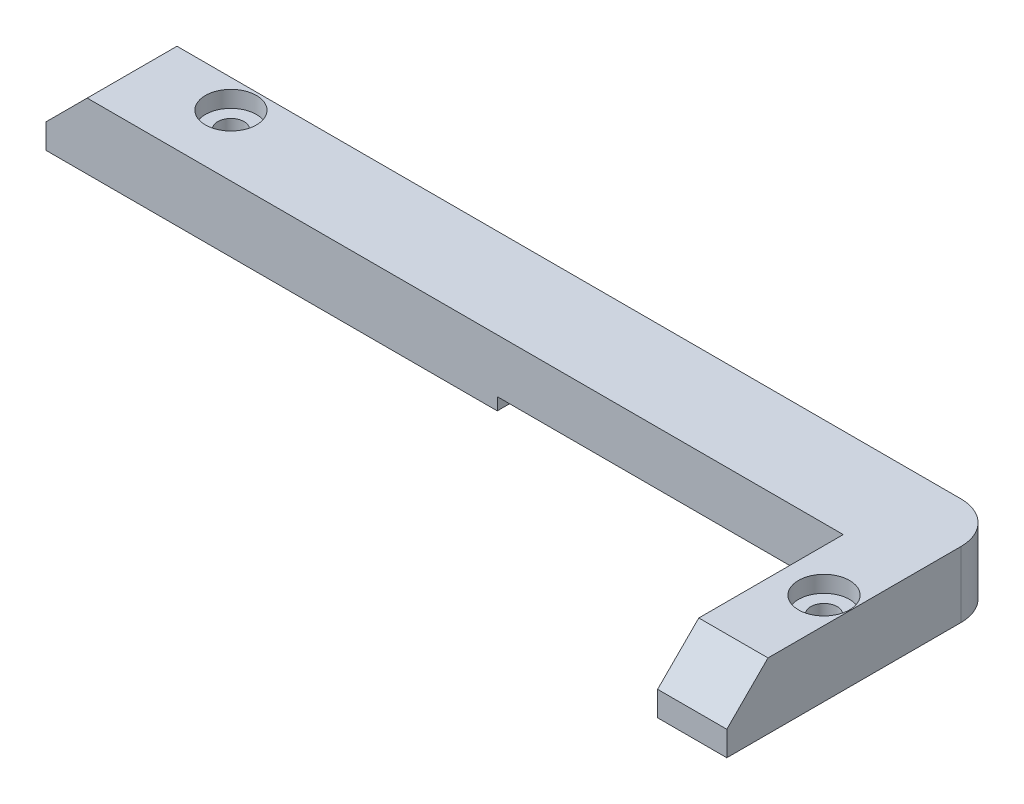
ISO-10303-21;
HEADER;
FILE_DESCRIPTION(('STEP AP214'),'2;1');
FILE_NAME('part.step','',(''),(''),'','','');
FILE_SCHEMA(('AUTOMOTIVE_DESIGN { 1 0 10303 214 1 1 1 1 }'));
ENDSEC;
DATA;
#1=APPLICATION_CONTEXT('core data for automotive mechanical design processes');
#2=APPLICATION_PROTOCOL_DEFINITION('international standard','automotive_design',2000,#1);
#3=PRODUCT_CONTEXT('',#1,'mechanical');
#4=PRODUCT('Part','Part','',(#3));
#5=PRODUCT_RELATED_PRODUCT_CATEGORY('part','',(#4));
#6=PRODUCT_DEFINITION_FORMATION('','',#4);
#7=PRODUCT_DEFINITION_CONTEXT('part definition',#1,'design');
#8=PRODUCT_DEFINITION('design','',#6,#7);
#9=PRODUCT_DEFINITION_SHAPE('','',#8);
#10=(LENGTH_UNIT() NAMED_UNIT(*) SI_UNIT(.MILLI.,.METRE.));
#11=(NAMED_UNIT(*) PLANE_ANGLE_UNIT() SI_UNIT($,.RADIAN.));
#12=(NAMED_UNIT(*) SI_UNIT($,.STERADIAN.) SOLID_ANGLE_UNIT());
#13=UNCERTAINTY_MEASURE_WITH_UNIT(LENGTH_MEASURE(1.E-05),#10,'distance_accuracy_value','');
#14=(GEOMETRIC_REPRESENTATION_CONTEXT(3) GLOBAL_UNCERTAINTY_ASSIGNED_CONTEXT((#13)) GLOBAL_UNIT_ASSIGNED_CONTEXT((#10,
#11,#12)) REPRESENTATION_CONTEXT('',''));
#15=CARTESIAN_POINT('',(0.,0.,0.));
#16=DIRECTION('',(0.,0.,1.));
#17=DIRECTION('',(1.,0.,0.));
#18=AXIS2_PLACEMENT_3D('',#15,#16,#17);
#19=CARTESIAN_POINT('',(328.95,0.,0.));
#20=DIRECTION('',(1.,0.,0.));
#21=DIRECTION('',(0.,0.,-1.));
#22=AXIS2_PLACEMENT_3D('',#19,#20,#21);
#23=PLANE('',#22);
#24=DIRECTION('',(0.,-1.,0.));
#25=VECTOR('',#24,1.);
#26=CARTESIAN_POINT('',(328.95,0.,-83.435));
#27=LINE('',#26,#25);
#28=CARTESIAN_POINT('',(328.95,2.99999999999998,-83.435));
#29=VERTEX_POINT('',#28);
#30=CARTESIAN_POINT('',(328.95,0.,-83.435));
#31=VERTEX_POINT('',#30);
#32=EDGE_CURVE('E206',#29,#31,#27,.T.);
#33=ORIENTED_EDGE('',*,*,#32,.F.);
#34=DIRECTION('',(0.,0.707106781186549,-0.707106781186547));
#35=VECTOR('',#34,1.);
#36=CARTESIAN_POINT('',(328.95,8.,-88.435));
#37=LINE('',#36,#35);
#38=CARTESIAN_POINT('',(328.95,8.,-88.435));
#39=VERTEX_POINT('',#38);
#40=EDGE_CURVE('E196',#29,#39,#37,.T.);
#41=ORIENTED_EDGE('',*,*,#40,.T.);
#42=DIRECTION('',(0.,0.,-1.));
#43=VECTOR('',#42,1.);
#44=CARTESIAN_POINT('',(328.95,8.,-6.9));
#45=LINE('',#44,#43);
#46=CARTESIAN_POINT('',(328.95,8.,-105.97));
#47=VERTEX_POINT('',#46);
#48=EDGE_CURVE('E203',#39,#47,#45,.T.);
#49=ORIENTED_EDGE('',*,*,#48,.T.);
#50=DIRECTION('',(0.,-1.,0.));
#51=VECTOR('',#50,1.);
#52=CARTESIAN_POINT('',(328.95,8.,-105.97));
#53=LINE('',#52,#51);
#54=CARTESIAN_POINT('',(328.95,1.5,-105.97));
#55=VERTEX_POINT('',#54);
#56=EDGE_CURVE('E215',#47,#55,#53,.T.);
#57=ORIENTED_EDGE('',*,*,#56,.T.);
#58=DIRECTION('',(0.,0.,1.));
#59=VECTOR('',#58,1.);
#60=CARTESIAN_POINT('',(328.95,1.5,-116.87));
#61=LINE('',#60,#59);
#62=CARTESIAN_POINT('',(328.95,1.5,-116.87));
#63=VERTEX_POINT('',#62);
#64=EDGE_CURVE('E252',#63,#55,#61,.T.);
#65=ORIENTED_EDGE('',*,*,#64,.F.);
#66=DIRECTION('',(0.,1.,0.));
#67=VECTOR('',#66,1.);
#68=CARTESIAN_POINT('',(328.95,-3.,-116.87));
#69=LINE('',#68,#67);
#70=CARTESIAN_POINT('',(328.95,0.,-116.87));
#71=VERTEX_POINT('',#70);
#72=EDGE_CURVE('E245',#71,#63,#69,.T.);
#73=ORIENTED_EDGE('',*,*,#72,.F.);
#74=DIRECTION('',(0.,0.,1.));
#75=VECTOR('',#74,1.);
#76=CARTESIAN_POINT('',(328.95,0.,0.));
#77=LINE('',#76,#75);
#78=EDGE_CURVE('E216',#71,#31,#77,.T.);
#79=ORIENTED_EDGE('',*,*,#78,.T.);
#80=EDGE_LOOP('',(#33,#41,#49,#57,#65,#73,#79));
#81=FACE_BOUND('',#80,.T.);
#82=ADVANCED_FACE('F46',(#81),#23,.F.);
#83=CARTESIAN_POINT('',(0.,0.,0.));
#84=DIRECTION('',(0.,-1.,0.));
#85=DIRECTION('',(0.,0.,-1.));
#86=AXIS2_PLACEMENT_3D('',#83,#84,#85);
#87=PLANE('',#86);
#88=CARTESIAN_POINT('',(334.15,0.,-98.435));
#89=DIRECTION('',(0.,1.,0.));
#90=DIRECTION('',(0.,0.,1.));
#91=AXIS2_PLACEMENT_3D('',#88,#89,#90);
#92=CIRCLE('',#91,1.59999999999999);
#93=CARTESIAN_POINT('',(334.15,0.,-96.835));
#94=VERTEX_POINT('',#93);
#95=EDGE_CURVE('E161',#94,#94,#92,.T.);
#96=ORIENTED_EDGE('',*,*,#95,.T.);
#97=EDGE_LOOP('',(#96));
#98=FACE_BOUND('',#97,.T.);
#99=DIRECTION('',(0.,0.,-1.));
#100=VECTOR('',#99,1.);
#101=CARTESIAN_POINT('',(337.35,0.,0.));
#102=LINE('',#101,#100);
#103=CARTESIAN_POINT('',(337.35,0.,-83.435));
#104=VERTEX_POINT('',#103);
#105=CARTESIAN_POINT('',(337.35,0.,-111.87));
#106=VERTEX_POINT('',#105);
#107=EDGE_CURVE('E157',#104,#106,#102,.T.);
#108=ORIENTED_EDGE('',*,*,#107,.F.);
#109=DIRECTION('',(1.,0.,0.));
#110=VECTOR('',#109,1.);
#111=CARTESIAN_POINT('',(232.17,0.,-83.435));
#112=LINE('',#111,#110);
#113=EDGE_CURVE('E149',#31,#104,#112,.T.);
#114=ORIENTED_EDGE('',*,*,#113,.F.);
#115=ORIENTED_EDGE('',*,*,#78,.F.);
#116=DIRECTION('',(-1.,0.,0.));
#117=VECTOR('',#116,1.);
#118=CARTESIAN_POINT('',(0.,0.,-116.87));
#119=LINE('',#118,#117);
#120=CARTESIAN_POINT('',(332.35,0.,-116.87));
#121=VERTEX_POINT('',#120);
#122=EDGE_CURVE('E156',#121,#71,#119,.T.);
#123=ORIENTED_EDGE('',*,*,#122,.F.);
#124=CARTESIAN_POINT('',(332.35,0.,-111.87));
#125=DIRECTION('',(0.,-1.,0.));
#126=DIRECTION('',(0.,0.,-1.));
#127=AXIS2_PLACEMENT_3D('',#124,#125,#126);
#128=CIRCLE('',#127,5.);
#129=EDGE_CURVE('E165',#121,#106,#128,.T.);
#130=ORIENTED_EDGE('',*,*,#129,.T.);
#131=EDGE_LOOP('',(#108,#114,#115,#123,#130));
#132=FACE_BOUND('',#131,.T.);
#133=ADVANCED_FACE('F281',(#98,#132),#87,.T.);
#134=CARTESIAN_POINT('',(0.,0.,-105.97));
#135=DIRECTION('',(0.,0.,-1.));
#136=DIRECTION('',(-1.,0.,0.));
#137=AXIS2_PLACEMENT_3D('',#134,#135,#136);
#138=PLANE('',#137);
#139=DIRECTION('',(-1.,0.,0.));
#140=VECTOR('',#139,1.);
#141=CARTESIAN_POINT('',(73.9,8.,-105.97));
#142=LINE('',#141,#140);
#143=CARTESIAN_POINT('',(237.17,8.,-105.97));
#144=VERTEX_POINT('',#143);
#145=EDGE_CURVE('E214',#47,#144,#142,.T.);
#146=ORIENTED_EDGE('',*,*,#145,.T.);
#147=DIRECTION('',(-0.707106781186544,-0.707106781186551,0.));
#148=VECTOR('',#147,1.);
#149=CARTESIAN_POINT('',(237.17,8.,-105.97));
#150=LINE('',#149,#148);
#151=CARTESIAN_POINT('',(232.17,3.,-105.97));
#152=VERTEX_POINT('',#151);
#153=EDGE_CURVE('E69',#144,#152,#150,.T.);
#154=ORIENTED_EDGE('',*,*,#153,.T.);
#155=DIRECTION('',(0.,1.,0.));
#156=VECTOR('',#155,1.);
#157=CARTESIAN_POINT('',(232.17,0.,-105.97));
#158=LINE('',#157,#156);
#159=CARTESIAN_POINT('',(232.17,0.,-105.97));
#160=VERTEX_POINT('',#159);
#161=EDGE_CURVE('E228',#160,#152,#158,.T.);
#162=ORIENTED_EDGE('',*,*,#161,.F.);
#163=DIRECTION('',(1.,0.,0.));
#164=VECTOR('',#163,1.);
#165=CARTESIAN_POINT('',(0.,0.,-105.97));
#166=LINE('',#165,#164);
#167=CARTESIAN_POINT('',(286.95,0.,-105.97));
#168=VERTEX_POINT('',#167);
#169=EDGE_CURVE('E148',#160,#168,#166,.T.);
#170=ORIENTED_EDGE('',*,*,#169,.T.);
#171=DIRECTION('',(0.,-1.,0.));
#172=VECTOR('',#171,1.);
#173=CARTESIAN_POINT('',(286.95,-3.00000000000001,-105.97));
#174=LINE('',#173,#172);
#175=CARTESIAN_POINT('',(286.95,1.5,-105.97));
#176=VERTEX_POINT('',#175);
#177=EDGE_CURVE('E249',#176,#168,#174,.T.);
#178=ORIENTED_EDGE('',*,*,#177,.F.);
#179=DIRECTION('',(-1.,0.,0.));
#180=VECTOR('',#179,1.);
#181=CARTESIAN_POINT('',(328.95,1.5,-105.97));
#182=LINE('',#181,#180);
#183=EDGE_CURVE('E182',#55,#176,#182,.T.);
#184=ORIENTED_EDGE('',*,*,#183,.F.);
#185=ORIENTED_EDGE('',*,*,#56,.F.);
#186=EDGE_LOOP('',(#146,#154,#162,#170,#178,#184,#185));
#187=FACE_BOUND('',#186,.T.);
#188=ADVANCED_FACE('F286',(#187),#138,.F.);
#189=CARTESIAN_POINT('',(0.,8.,0.));
#190=DIRECTION('',(0.,-1.,0.));
#191=DIRECTION('',(0.,0.,-1.));
#192=AXIS2_PLACEMENT_3D('',#189,#190,#191);
#193=PLANE('',#192);
#194=CARTESIAN_POINT('',(247.17,8.,-113.42));
#195=DIRECTION('',(0.,1.,0.));
#196=DIRECTION('',(0.,0.,1.));
#197=AXIS2_PLACEMENT_3D('',#194,#195,#196);
#198=CIRCLE('',#197,3.09999999999999);
#199=CARTESIAN_POINT('',(247.17,8.,-110.32));
#200=VERTEX_POINT('',#199);
#201=EDGE_CURVE('E237',#200,#200,#198,.T.);
#202=ORIENTED_EDGE('',*,*,#201,.F.);
#203=EDGE_LOOP('',(#202));
#204=FACE_BOUND('',#203,.T.);
#205=CARTESIAN_POINT('',(334.15,8.,-98.435));
#206=DIRECTION('',(0.,1.,0.));
#207=DIRECTION('',(0.,0.,1.));
#208=AXIS2_PLACEMENT_3D('',#205,#206,#207);
#209=CIRCLE('',#208,3.09999999999999);
#210=CARTESIAN_POINT('',(334.15,8.,-95.335));
#211=VERTEX_POINT('',#210);
#212=EDGE_CURVE('E234',#211,#211,#209,.T.);
#213=ORIENTED_EDGE('',*,*,#212,.F.);
#214=EDGE_LOOP('',(#213));
#215=FACE_BOUND('',#214,.T.);
#216=ORIENTED_EDGE('',*,*,#48,.F.);
#217=DIRECTION('',(1.,0.,0.));
#218=VECTOR('',#217,1.);
#219=CARTESIAN_POINT('',(337.35,8.,-88.435));
#220=LINE('',#219,#218);
#221=CARTESIAN_POINT('',(337.35,8.,-88.435));
#222=VERTEX_POINT('',#221);
#223=EDGE_CURVE('E189',#39,#222,#220,.T.);
#224=ORIENTED_EDGE('',*,*,#223,.T.);
#225=DIRECTION('',(0.,0.,-1.));
#226=VECTOR('',#225,1.);
#227=CARTESIAN_POINT('',(337.35,8.,0.));
#228=LINE('',#227,#226);
#229=CARTESIAN_POINT('',(337.35,8.,-111.87));
#230=VERTEX_POINT('',#229);
#231=EDGE_CURVE('E160',#222,#230,#228,.T.);
#232=ORIENTED_EDGE('',*,*,#231,.T.);
#233=CARTESIAN_POINT('',(332.35,8.,-111.87));
#234=DIRECTION('',(0.,-1.,0.));
#235=DIRECTION('',(0.,0.,-1.));
#236=AXIS2_PLACEMENT_3D('',#233,#234,#235);
#237=CIRCLE('',#236,5.);
#238=CARTESIAN_POINT('',(332.35,8.,-116.87));
#239=VERTEX_POINT('',#238);
#240=EDGE_CURVE('E168',#230,#239,#237,.F.);
#241=ORIENTED_EDGE('',*,*,#240,.T.);
#242=DIRECTION('',(-1.,0.,0.));
#243=VECTOR('',#242,1.);
#244=CARTESIAN_POINT('',(0.,8.,-116.87));
#245=LINE('',#244,#243);
#246=CARTESIAN_POINT('',(237.17,8.,-116.87));
#247=VERTEX_POINT('',#246);
#248=EDGE_CURVE('E169',#239,#247,#245,.T.);
#249=ORIENTED_EDGE('',*,*,#248,.T.);
#250=DIRECTION('',(0.,0.,1.));
#251=VECTOR('',#250,1.);
#252=CARTESIAN_POINT('',(237.17,8.,-105.97));
#253=LINE('',#252,#251);
#254=EDGE_CURVE('E186',#247,#144,#253,.T.);
#255=ORIENTED_EDGE('',*,*,#254,.T.);
#256=ORIENTED_EDGE('',*,*,#145,.F.);
#257=EDGE_LOOP('',(#216,#224,#232,#241,#249,#255,#256));
#258=FACE_BOUND('',#257,.T.);
#259=ADVANCED_FACE('F212',(#204,#215,#258),#193,.F.);
#260=CARTESIAN_POINT('',(247.17,0.,-113.42));
#261=DIRECTION('',(0.,1.,0.));
#262=DIRECTION('',(0.,0.,1.));
#263=AXIS2_PLACEMENT_3D('',#260,#261,#262);
#264=CIRCLE('',#263,1.59999999999999);
#265=CARTESIAN_POINT('',(247.17,0.,-111.82));
#266=VERTEX_POINT('',#265);
#267=EDGE_CURVE('E265',#266,#266,#264,.T.);
#268=ORIENTED_EDGE('',*,*,#267,.T.);
#269=EDGE_LOOP('',(#268));
#270=FACE_BOUND('',#269,.T.);
#271=ORIENTED_EDGE('',*,*,#169,.F.);
#272=DIRECTION('',(0.,0.,1.));
#273=VECTOR('',#272,1.);
#274=CARTESIAN_POINT('',(232.17,0.,-117.98568135859));
#275=LINE('',#274,#273);
#276=CARTESIAN_POINT('',(232.17,0.,-116.87));
#277=VERTEX_POINT('',#276);
#278=EDGE_CURVE('E135',#277,#160,#275,.T.);
#279=ORIENTED_EDGE('',*,*,#278,.F.);
#280=CARTESIAN_POINT('',(286.95,0.,-116.87));
#281=VERTEX_POINT('',#280);
#282=EDGE_CURVE('E147',#281,#277,#119,.T.);
#283=ORIENTED_EDGE('',*,*,#282,.F.);
#284=DIRECTION('',(0.,0.,-1.));
#285=VECTOR('',#284,1.);
#286=CARTESIAN_POINT('',(286.95,0.,0.));
#287=LINE('',#286,#285);
#288=EDGE_CURVE('E259',#168,#281,#287,.T.);
#289=ORIENTED_EDGE('',*,*,#288,.F.);
#290=EDGE_LOOP('',(#271,#279,#283,#289));
#291=FACE_BOUND('',#290,.T.);
#292=ADVANCED_FACE('F145',(#270,#291),#87,.T.);
#293=CARTESIAN_POINT('',(337.35,8.,0.));
#294=DIRECTION('',(-1.,0.,0.));
#295=DIRECTION('',(0.,0.,1.));
#296=AXIS2_PLACEMENT_3D('',#293,#294,#295);
#297=PLANE('',#296);
#298=ORIENTED_EDGE('',*,*,#231,.F.);
#299=DIRECTION('',(0.,-0.707106781186549,0.707106781186547));
#300=VECTOR('',#299,1.);
#301=CARTESIAN_POINT('',(337.35,8.,-88.435));
#302=LINE('',#301,#300);
#303=CARTESIAN_POINT('',(337.35,2.99999999999998,-83.435));
#304=VERTEX_POINT('',#303);
#305=EDGE_CURVE('E192',#222,#304,#302,.T.);
#306=ORIENTED_EDGE('',*,*,#305,.T.);
#307=DIRECTION('',(0.,1.,0.));
#308=VECTOR('',#307,1.);
#309=CARTESIAN_POINT('',(337.35,8.,-83.435));
#310=LINE('',#309,#308);
#311=EDGE_CURVE('E139',#104,#304,#310,.T.);
#312=ORIENTED_EDGE('',*,*,#311,.F.);
#313=ORIENTED_EDGE('',*,*,#107,.T.);
#314=DIRECTION('',(0.,-1.,0.));
#315=VECTOR('',#314,1.);
#316=CARTESIAN_POINT('',(337.35,8.,-111.87));
#317=LINE('',#316,#315);
#318=EDGE_CURVE('E140',#106,#230,#317,.F.);
#319=ORIENTED_EDGE('',*,*,#318,.T.);
#320=EDGE_LOOP('',(#298,#306,#312,#313,#319));
#321=FACE_BOUND('',#320,.T.);
#322=ADVANCED_FACE('F221',(#321),#297,.F.);
#323=CARTESIAN_POINT('',(0.,8.,-116.87));
#324=DIRECTION('',(0.,0.,1.));
#325=DIRECTION('',(1.,0.,0.));
#326=AXIS2_PLACEMENT_3D('',#323,#324,#325);
#327=PLANE('',#326);
#328=DIRECTION('',(0.,-1.,0.));
#329=VECTOR('',#328,1.);
#330=CARTESIAN_POINT('',(232.17,8.,-116.87));
#331=LINE('',#330,#329);
#332=CARTESIAN_POINT('',(232.17,3.,-116.87));
#333=VERTEX_POINT('',#332);
#334=EDGE_CURVE('E132',#333,#277,#331,.T.);
#335=ORIENTED_EDGE('',*,*,#334,.F.);
#336=DIRECTION('',(0.707106781186544,0.707106781186551,0.));
#337=VECTOR('',#336,1.);
#338=CARTESIAN_POINT('',(237.17,8.,-116.87));
#339=LINE('',#338,#337);
#340=EDGE_CURVE('E12',#333,#247,#339,.T.);
#341=ORIENTED_EDGE('',*,*,#340,.T.);
#342=ORIENTED_EDGE('',*,*,#248,.F.);
#343=DIRECTION('',(0.,-1.,0.));
#344=VECTOR('',#343,1.);
#345=CARTESIAN_POINT('',(332.35,8.,-116.87));
#346=LINE('',#345,#344);
#347=EDGE_CURVE('E171',#239,#121,#346,.T.);
#348=ORIENTED_EDGE('',*,*,#347,.T.);
#349=ORIENTED_EDGE('',*,*,#122,.T.);
#350=ORIENTED_EDGE('',*,*,#72,.T.);
#351=DIRECTION('',(-1.,0.,0.));
#352=VECTOR('',#351,1.);
#353=CARTESIAN_POINT('',(328.95,1.5,-116.87));
#354=LINE('',#353,#352);
#355=CARTESIAN_POINT('',(286.95,1.5,-116.87));
#356=VERTEX_POINT('',#355);
#357=EDGE_CURVE('E248',#63,#356,#354,.T.);
#358=ORIENTED_EDGE('',*,*,#357,.T.);
#359=DIRECTION('',(0.,-1.,0.));
#360=VECTOR('',#359,1.);
#361=CARTESIAN_POINT('',(286.95,-3.00000000000001,-116.87));
#362=LINE('',#361,#360);
#363=EDGE_CURVE('E155',#356,#281,#362,.T.);
#364=ORIENTED_EDGE('',*,*,#363,.T.);
#365=ORIENTED_EDGE('',*,*,#282,.T.);
#366=EDGE_LOOP('',(#335,#341,#342,#348,#349,#350,#358,#364,#365));
#367=FACE_BOUND('',#366,.T.);
#368=ADVANCED_FACE('F152',(#367),#327,.F.);
#369=CARTESIAN_POINT('',(334.15,8.,-98.435));
#370=DIRECTION('',(0.,1.,0.));
#371=DIRECTION('',(0.,0.,1.));
#372=AXIS2_PLACEMENT_3D('',#369,#370,#371);
#373=CYLINDRICAL_SURFACE('',#372,1.59999999999999);
#374=ORIENTED_EDGE('',*,*,#95,.F.);
#375=EDGE_LOOP('',(#374));
#376=FACE_BOUND('',#375,.T.);
#377=CARTESIAN_POINT('',(334.15,6.,-98.435));
#378=DIRECTION('',(0.,1.,0.));
#379=DIRECTION('',(0.,0.,1.));
#380=AXIS2_PLACEMENT_3D('',#377,#378,#379);
#381=CIRCLE('',#380,1.59999999999999);
#382=CARTESIAN_POINT('',(334.15,6.,-96.835));
#383=VERTEX_POINT('',#382);
#384=EDGE_CURVE('E179',#383,#383,#381,.F.);
#385=ORIENTED_EDGE('',*,*,#384,.F.);
#386=EDGE_LOOP('',(#385));
#387=FACE_BOUND('',#386,.T.);
#388=ADVANCED_FACE('F299',(#376,#387),#373,.F.);
#389=CARTESIAN_POINT('',(247.17,8.,-113.42));
#390=DIRECTION('',(0.,1.,0.));
#391=DIRECTION('',(0.,0.,1.));
#392=AXIS2_PLACEMENT_3D('',#389,#390,#391);
#393=CYLINDRICAL_SURFACE('',#392,1.59999999999999);
#394=ORIENTED_EDGE('',*,*,#267,.F.);
#395=EDGE_LOOP('',(#394));
#396=FACE_BOUND('',#395,.T.);
#397=CARTESIAN_POINT('',(247.17,6.,-113.42));
#398=DIRECTION('',(0.,1.,0.));
#399=DIRECTION('',(0.,0.,1.));
#400=AXIS2_PLACEMENT_3D('',#397,#398,#399);
#401=CIRCLE('',#400,1.59999999999999);
#402=CARTESIAN_POINT('',(247.17,6.,-111.82));
#403=VERTEX_POINT('',#402);
#404=EDGE_CURVE('E176',#403,#403,#401,.F.);
#405=ORIENTED_EDGE('',*,*,#404,.F.);
#406=EDGE_LOOP('',(#405));
#407=FACE_BOUND('',#406,.T.);
#408=ADVANCED_FACE('F295',(#396,#407),#393,.F.);
#409=CARTESIAN_POINT('',(332.35,8.,-111.87));
#410=DIRECTION('',(0.,-1.,0.));
#411=DIRECTION('',(0.,0.,-1.));
#412=AXIS2_PLACEMENT_3D('',#409,#410,#411);
#413=CYLINDRICAL_SURFACE('',#412,5.);
#414=ORIENTED_EDGE('',*,*,#240,.F.);
#415=ORIENTED_EDGE('',*,*,#318,.F.);
#416=ORIENTED_EDGE('',*,*,#129,.F.);
#417=ORIENTED_EDGE('',*,*,#347,.F.);
#418=EDGE_LOOP('',(#414,#415,#416,#417));
#419=FACE_BOUND('',#418,.T.);
#420=ADVANCED_FACE('F298',(#419),#413,.T.);
#421=CARTESIAN_POINT('',(286.95,-3.00000000000001,-116.87));
#422=DIRECTION('',(-1.,0.,0.));
#423=DIRECTION('',(0.,0.,1.));
#424=AXIS2_PLACEMENT_3D('',#421,#422,#423);
#425=PLANE('',#424);
#426=ORIENTED_EDGE('',*,*,#177,.T.);
#427=ORIENTED_EDGE('',*,*,#288,.T.);
#428=ORIENTED_EDGE('',*,*,#363,.F.);
#429=DIRECTION('',(0.,0.,1.));
#430=VECTOR('',#429,1.);
#431=CARTESIAN_POINT('',(286.95,1.5,-116.87));
#432=LINE('',#431,#430);
#433=EDGE_CURVE('E257',#356,#176,#432,.T.);
#434=ORIENTED_EDGE('',*,*,#433,.T.);
#435=EDGE_LOOP('',(#426,#427,#428,#434));
#436=FACE_BOUND('',#435,.T.);
#437=ADVANCED_FACE('F312',(#436),#425,.F.);
#438=CARTESIAN_POINT('',(328.95,1.5,-116.87));
#439=DIRECTION('',(0.,1.,0.));
#440=DIRECTION('',(-1.,0.,0.));
#441=AXIS2_PLACEMENT_3D('',#438,#439,#440);
#442=PLANE('',#441);
#443=ORIENTED_EDGE('',*,*,#183,.T.);
#444=ORIENTED_EDGE('',*,*,#433,.F.);
#445=ORIENTED_EDGE('',*,*,#357,.F.);
#446=ORIENTED_EDGE('',*,*,#64,.T.);
#447=EDGE_LOOP('',(#443,#444,#445,#446));
#448=FACE_BOUND('',#447,.T.);
#449=ADVANCED_FACE('F291',(#448),#442,.F.);
#450=CARTESIAN_POINT('',(247.17,6.,-113.42));
#451=DIRECTION('',(0.,1.,0.));
#452=DIRECTION('',(0.,0.,1.));
#453=AXIS2_PLACEMENT_3D('',#450,#451,#452);
#454=PLANE('',#453);
#455=CARTESIAN_POINT('',(247.17,6.,-113.42));
#456=DIRECTION('',(0.,1.,0.));
#457=DIRECTION('',(0.,0.,1.));
#458=AXIS2_PLACEMENT_3D('',#455,#456,#457);
#459=CIRCLE('',#458,3.09999999999999);
#460=CARTESIAN_POINT('',(247.17,6.,-110.32));
#461=VERTEX_POINT('',#460);
#462=EDGE_CURVE('E180',#461,#461,#459,.T.);
#463=ORIENTED_EDGE('',*,*,#462,.T.);
#464=EDGE_LOOP('',(#463));
#465=FACE_BOUND('',#464,.T.);
#466=ORIENTED_EDGE('',*,*,#404,.T.);
#467=EDGE_LOOP('',(#466));
#468=FACE_BOUND('',#467,.T.);
#469=ADVANCED_FACE('F330',(#465,#468),#454,.T.);
#470=CARTESIAN_POINT('',(247.17,6.,-113.42));
#471=DIRECTION('',(0.,1.,0.));
#472=DIRECTION('',(0.,0.,1.));
#473=AXIS2_PLACEMENT_3D('',#470,#471,#472);
#474=CYLINDRICAL_SURFACE('',#473,3.09999999999999);
#475=ORIENTED_EDGE('',*,*,#462,.F.);
#476=EDGE_LOOP('',(#475));
#477=FACE_BOUND('',#476,.T.);
#478=ORIENTED_EDGE('',*,*,#201,.T.);
#479=EDGE_LOOP('',(#478));
#480=FACE_BOUND('',#479,.T.);
#481=ADVANCED_FACE('F334',(#477,#480),#474,.F.);
#482=CARTESIAN_POINT('',(334.15,6.,-98.435));
#483=DIRECTION('',(0.,1.,0.));
#484=DIRECTION('',(0.,0.,1.));
#485=AXIS2_PLACEMENT_3D('',#482,#483,#484);
#486=PLANE('',#485);
#487=CARTESIAN_POINT('',(334.15,6.,-98.435));
#488=DIRECTION('',(0.,1.,0.));
#489=DIRECTION('',(0.,0.,1.));
#490=AXIS2_PLACEMENT_3D('',#487,#488,#489);
#491=CIRCLE('',#490,3.09999999999999);
#492=CARTESIAN_POINT('',(334.15,6.,-95.335));
#493=VERTEX_POINT('',#492);
#494=EDGE_CURVE('E240',#493,#493,#491,.T.);
#495=ORIENTED_EDGE('',*,*,#494,.T.);
#496=EDGE_LOOP('',(#495));
#497=FACE_BOUND('',#496,.T.);
#498=ORIENTED_EDGE('',*,*,#384,.T.);
#499=EDGE_LOOP('',(#498));
#500=FACE_BOUND('',#499,.T.);
#501=ADVANCED_FACE('F340',(#497,#500),#486,.T.);
#502=CARTESIAN_POINT('',(334.15,6.,-98.435));
#503=DIRECTION('',(0.,1.,0.));
#504=DIRECTION('',(0.,0.,1.));
#505=AXIS2_PLACEMENT_3D('',#502,#503,#504);
#506=CYLINDRICAL_SURFACE('',#505,3.09999999999999);
#507=ORIENTED_EDGE('',*,*,#494,.F.);
#508=EDGE_LOOP('',(#507));
#509=FACE_BOUND('',#508,.T.);
#510=ORIENTED_EDGE('',*,*,#212,.T.);
#511=EDGE_LOOP('',(#510));
#512=FACE_BOUND('',#511,.T.);
#513=ADVANCED_FACE('F349',(#509,#512),#506,.F.);
#514=CARTESIAN_POINT('',(232.17,0.,-117.98568135859));
#515=DIRECTION('',(-1.,0.,0.));
#516=DIRECTION('',(0.,0.,1.));
#517=AXIS2_PLACEMENT_3D('',#514,#515,#516);
#518=PLANE('',#517);
#519=ORIENTED_EDGE('',*,*,#161,.T.);
#520=DIRECTION('',(0.,0.,-1.));
#521=VECTOR('',#520,1.);
#522=CARTESIAN_POINT('',(232.17,3.,-116.87));
#523=LINE('',#522,#521);
#524=EDGE_CURVE('E55',#152,#333,#523,.T.);
#525=ORIENTED_EDGE('',*,*,#524,.T.);
#526=ORIENTED_EDGE('',*,*,#334,.T.);
#527=ORIENTED_EDGE('',*,*,#278,.T.);
#528=EDGE_LOOP('',(#519,#525,#526,#527));
#529=FACE_BOUND('',#528,.T.);
#530=ADVANCED_FACE('F134',(#529),#518,.T.);
#531=CARTESIAN_POINT('',(232.17,0.,-83.435));
#532=DIRECTION('',(0.,0.,1.));
#533=DIRECTION('',(1.,0.,0.));
#534=AXIS2_PLACEMENT_3D('',#531,#532,#533);
#535=PLANE('',#534);
#536=ORIENTED_EDGE('',*,*,#311,.T.);
#537=DIRECTION('',(-1.,0.,0.));
#538=VECTOR('',#537,1.);
#539=CARTESIAN_POINT('',(328.95,2.99999999999998,-83.435));
#540=LINE('',#539,#538);
#541=EDGE_CURVE('E194',#304,#29,#540,.T.);
#542=ORIENTED_EDGE('',*,*,#541,.T.);
#543=ORIENTED_EDGE('',*,*,#32,.T.);
#544=ORIENTED_EDGE('',*,*,#113,.T.);
#545=EDGE_LOOP('',(#536,#542,#543,#544));
#546=FACE_BOUND('',#545,.T.);
#547=ADVANCED_FACE('F224',(#546),#535,.T.);
#548=CARTESIAN_POINT('',(0.,8.,-88.435));
#549=DIRECTION('',(0.,0.707106781186547,0.707106781186549));
#550=DIRECTION('',(-1.,0.,0.));
#551=AXIS2_PLACEMENT_3D('',#548,#549,#550);
#552=PLANE('',#551);
#553=ORIENTED_EDGE('',*,*,#40,.F.);
#554=ORIENTED_EDGE('',*,*,#541,.F.);
#555=ORIENTED_EDGE('',*,*,#305,.F.);
#556=ORIENTED_EDGE('',*,*,#223,.F.);
#557=EDGE_LOOP('',(#553,#554,#555,#556));
#558=FACE_BOUND('',#557,.T.);
#559=ADVANCED_FACE('F218',(#558),#552,.T.);
#560=CARTESIAN_POINT('',(237.17,8.,0.));
#561=DIRECTION('',(-0.707106781186551,0.707106781186544,0.));
#562=DIRECTION('',(0.,0.,-1.));
#563=AXIS2_PLACEMENT_3D('',#560,#561,#562);
#564=PLANE('',#563);
#565=ORIENTED_EDGE('',*,*,#340,.F.);
#566=ORIENTED_EDGE('',*,*,#524,.F.);
#567=ORIENTED_EDGE('',*,*,#153,.F.);
#568=ORIENTED_EDGE('',*,*,#254,.F.);
#569=EDGE_LOOP('',(#565,#566,#567,#568));
#570=FACE_BOUND('',#569,.T.);
#571=ADVANCED_FACE('F49',(#570),#564,.T.);
#572=CLOSED_SHELL('',(#82,#133,#188,#259,#292,#322,#368,#388,#408,#420,#437,#449,#469,#481,#501,
#513,#530,#547,#559,#571));
#573=MANIFOLD_SOLID_BREP('B2',#572);
#574=ADVANCED_BREP_SHAPE_REPRESENTATION('',(#18,#573),#14);
#575=SHAPE_DEFINITION_REPRESENTATION(#9,#574);
ENDSEC;
END-ISO-10303-21;
